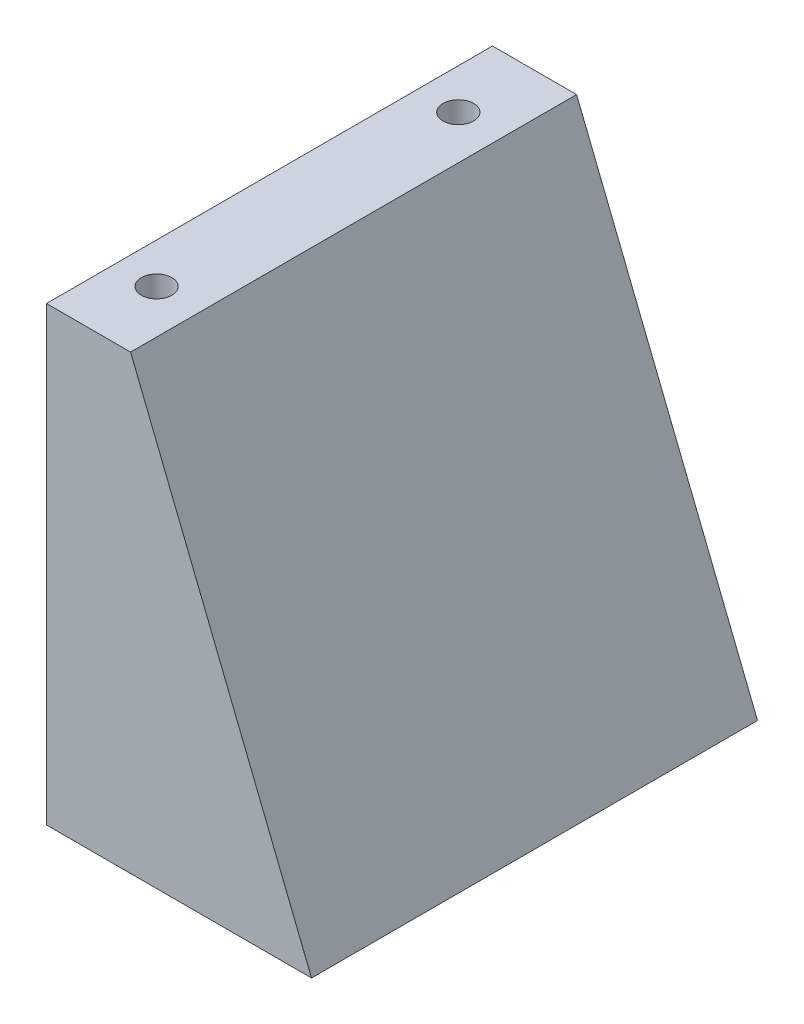
ISO-10303-21;
HEADER;
FILE_DESCRIPTION(('STEP AP214'),'2;1');
FILE_NAME('part.step','',(''),(''),'','','');
FILE_SCHEMA(('AUTOMOTIVE_DESIGN { 1 0 10303 214 1 1 1 1 }'));
ENDSEC;
DATA;
#1=APPLICATION_CONTEXT('core data for automotive mechanical design processes');
#2=APPLICATION_PROTOCOL_DEFINITION('international standard','automotive_design',2000,#1);
#3=PRODUCT_CONTEXT('',#1,'mechanical');
#4=PRODUCT('Part','Part','',(#3));
#5=PRODUCT_RELATED_PRODUCT_CATEGORY('part','',(#4));
#6=PRODUCT_DEFINITION_FORMATION('','',#4);
#7=PRODUCT_DEFINITION_CONTEXT('part definition',#1,'design');
#8=PRODUCT_DEFINITION('design','',#6,#7);
#9=PRODUCT_DEFINITION_SHAPE('','',#8);
#10=(LENGTH_UNIT() NAMED_UNIT(*) SI_UNIT(.MILLI.,.METRE.));
#11=(NAMED_UNIT(*) PLANE_ANGLE_UNIT() SI_UNIT($,.RADIAN.));
#12=(NAMED_UNIT(*) SI_UNIT($,.STERADIAN.) SOLID_ANGLE_UNIT());
#13=UNCERTAINTY_MEASURE_WITH_UNIT(LENGTH_MEASURE(1.E-05),#10,'distance_accuracy_value','');
#14=(GEOMETRIC_REPRESENTATION_CONTEXT(3) GLOBAL_UNCERTAINTY_ASSIGNED_CONTEXT((#13)) GLOBAL_UNIT_ASSIGNED_CONTEXT((#10,
#11,#12)) REPRESENTATION_CONTEXT('',''));
#15=CARTESIAN_POINT('',(0.,0.,0.));
#16=DIRECTION('',(0.,0.,1.));
#17=DIRECTION('',(1.,0.,0.));
#18=AXIS2_PLACEMENT_3D('',#15,#16,#17);
#19=CARTESIAN_POINT('',(0.,0.,43.75));
#20=DIRECTION('',(0.,1.,0.));
#21=DIRECTION('',(0.,0.,1.));
#22=AXIS2_PLACEMENT_3D('',#19,#20,#21);
#23=PLANE('',#22);
#24=DIRECTION('',(1.,0.,0.));
#25=VECTOR('',#24,1.);
#26=CARTESIAN_POINT('',(0.,0.,0.));
#27=LINE('',#26,#25);
#28=CARTESIAN_POINT('',(0.,0.,0.));
#29=VERTEX_POINT('',#28);
#30=CARTESIAN_POINT('',(26.,0.,0.));
#31=VERTEX_POINT('',#30);
#32=EDGE_CURVE('E106',#29,#31,#27,.T.);
#33=ORIENTED_EDGE('',*,*,#32,.T.);
#34=DIRECTION('',(0.,0.,-1.));
#35=VECTOR('',#34,1.);
#36=CARTESIAN_POINT('',(26.,0.,43.75));
#37=LINE('',#36,#35);
#38=CARTESIAN_POINT('',(26.,0.,43.75));
#39=VERTEX_POINT('',#38);
#40=EDGE_CURVE('E11',#39,#31,#37,.T.);
#41=ORIENTED_EDGE('',*,*,#40,.F.);
#42=DIRECTION('',(1.,0.,0.));
#43=VECTOR('',#42,1.);
#44=CARTESIAN_POINT('',(0.,0.,43.75));
#45=LINE('',#44,#43);
#46=CARTESIAN_POINT('',(0.,0.,43.75));
#47=VERTEX_POINT('',#46);
#48=EDGE_CURVE('E90',#47,#39,#45,.T.);
#49=ORIENTED_EDGE('',*,*,#48,.F.);
#50=DIRECTION('',(0.,0.,-1.));
#51=VECTOR('',#50,1.);
#52=CARTESIAN_POINT('',(0.,0.,43.75));
#53=LINE('',#52,#51);
#54=EDGE_CURVE('E102',#47,#29,#53,.T.);
#55=ORIENTED_EDGE('',*,*,#54,.T.);
#56=EDGE_LOOP('',(#33,#41,#49,#55));
#57=FACE_BOUND('',#56,.T.);
#58=ADVANCED_FACE('F38',(#57),#23,.F.);
#59=CARTESIAN_POINT('',(26.,0.,43.75));
#60=DIRECTION('',(-0.928259767790361,-0.37193252546905,0.));
#61=DIRECTION('',(0.37193252546905,-0.928259767790361,0.));
#62=AXIS2_PLACEMENT_3D('',#59,#60,#61);
#63=PLANE('',#62);
#64=DIRECTION('',(-0.37193252546905,0.928259767790361,0.));
#65=VECTOR('',#64,1.);
#66=CARTESIAN_POINT('',(26.,0.,0.));
#67=LINE('',#66,#65);
#68=CARTESIAN_POINT('',(8.25,44.3,0.));
#69=VERTEX_POINT('',#68);
#70=EDGE_CURVE('E95',#31,#69,#67,.T.);
#71=ORIENTED_EDGE('',*,*,#70,.T.);
#72=DIRECTION('',(0.,0.,-1.));
#73=VECTOR('',#72,1.);
#74=CARTESIAN_POINT('',(8.25,44.3,43.75));
#75=LINE('',#74,#73);
#76=CARTESIAN_POINT('',(8.25,44.3,43.75));
#77=VERTEX_POINT('',#76);
#78=EDGE_CURVE('E47',#77,#69,#75,.T.);
#79=ORIENTED_EDGE('',*,*,#78,.F.);
#80=DIRECTION('',(-0.37193252546905,0.928259767790361,0.));
#81=VECTOR('',#80,1.);
#82=CARTESIAN_POINT('',(26.,0.,43.75));
#83=LINE('',#82,#81);
#84=EDGE_CURVE('E85',#39,#77,#83,.T.);
#85=ORIENTED_EDGE('',*,*,#84,.F.);
#86=ORIENTED_EDGE('',*,*,#40,.T.);
#87=EDGE_LOOP('',(#71,#79,#85,#86));
#88=FACE_BOUND('',#87,.T.);
#89=ADVANCED_FACE('F94',(#88),#63,.F.);
#90=CARTESIAN_POINT('',(8.25,44.3,43.75));
#91=DIRECTION('',(0.,-1.,0.));
#92=DIRECTION('',(0.,0.,-1.));
#93=AXIS2_PLACEMENT_3D('',#90,#91,#92);
#94=PLANE('',#93);
#95=CARTESIAN_POINT('',(3.95,44.3,7.3));
#96=DIRECTION('',(0.,1.,0.));
#97=DIRECTION('',(0.,0.,1.));
#98=AXIS2_PLACEMENT_3D('',#95,#96,#97);
#99=CIRCLE('',#98,1.5);
#100=CARTESIAN_POINT('',(3.95,44.3,8.8));
#101=VERTEX_POINT('',#100);
#102=EDGE_CURVE('E167',#101,#101,#99,.T.);
#103=ORIENTED_EDGE('',*,*,#102,.F.);
#104=EDGE_LOOP('',(#103));
#105=FACE_BOUND('',#104,.T.);
#106=CARTESIAN_POINT('',(3.95,44.3,36.9));
#107=DIRECTION('',(0.,1.,0.));
#108=DIRECTION('',(0.,0.,1.));
#109=AXIS2_PLACEMENT_3D('',#106,#107,#108);
#110=CIRCLE('',#109,1.5);
#111=CARTESIAN_POINT('',(3.95,44.3,38.4));
#112=VERTEX_POINT('',#111);
#113=EDGE_CURVE('E159',#112,#112,#110,.T.);
#114=ORIENTED_EDGE('',*,*,#113,.F.);
#115=EDGE_LOOP('',(#114));
#116=FACE_BOUND('',#115,.T.);
#117=DIRECTION('',(-1.,0.,0.));
#118=VECTOR('',#117,1.);
#119=CARTESIAN_POINT('',(8.25,44.3,0.));
#120=LINE('',#119,#118);
#121=CARTESIAN_POINT('',(0.,44.3,0.));
#122=VERTEX_POINT('',#121);
#123=EDGE_CURVE('E72',#69,#122,#120,.T.);
#124=ORIENTED_EDGE('',*,*,#123,.T.);
#125=DIRECTION('',(0.,0.,-1.));
#126=VECTOR('',#125,1.);
#127=CARTESIAN_POINT('',(0.,44.3,43.75));
#128=LINE('',#127,#126);
#129=CARTESIAN_POINT('',(0.,44.3,43.75));
#130=VERTEX_POINT('',#129);
#131=EDGE_CURVE('E97',#130,#122,#128,.T.);
#132=ORIENTED_EDGE('',*,*,#131,.F.);
#133=DIRECTION('',(-1.,0.,0.));
#134=VECTOR('',#133,1.);
#135=CARTESIAN_POINT('',(8.25,44.3,43.75));
#136=LINE('',#135,#134);
#137=EDGE_CURVE('E88',#77,#130,#136,.T.);
#138=ORIENTED_EDGE('',*,*,#137,.F.);
#139=ORIENTED_EDGE('',*,*,#78,.T.);
#140=EDGE_LOOP('',(#124,#132,#138,#139));
#141=FACE_BOUND('',#140,.T.);
#142=ADVANCED_FACE('F98',(#105,#116,#141),#94,.F.);
#143=CARTESIAN_POINT('',(0.,0.,43.75));
#144=DIRECTION('',(1.,0.,0.));
#145=DIRECTION('',(0.,0.,-1.));
#146=AXIS2_PLACEMENT_3D('',#143,#144,#145);
#147=PLANE('',#146);
#148=CARTESIAN_POINT('',(0.,38.15,37.875));
#149=DIRECTION('',(-1.,0.,0.));
#150=DIRECTION('',(0.,0.,1.));
#151=AXIS2_PLACEMENT_3D('',#148,#149,#150);
#152=CIRCLE('',#151,1.6);
#153=CARTESIAN_POINT('',(0.,38.15,39.475));
#154=VERTEX_POINT('',#153);
#155=EDGE_CURVE('E144',#154,#154,#152,.T.);
#156=ORIENTED_EDGE('',*,*,#155,.F.);
#157=EDGE_LOOP('',(#156));
#158=FACE_BOUND('',#157,.T.);
#159=CARTESIAN_POINT('',(0.,6.15,5.875));
#160=DIRECTION('',(-1.,0.,0.));
#161=DIRECTION('',(0.,0.,1.));
#162=AXIS2_PLACEMENT_3D('',#159,#160,#161);
#163=CIRCLE('',#162,1.6);
#164=CARTESIAN_POINT('',(0.,6.15,7.475));
#165=VERTEX_POINT('',#164);
#166=EDGE_CURVE('E135',#165,#165,#163,.T.);
#167=ORIENTED_EDGE('',*,*,#166,.F.);
#168=EDGE_LOOP('',(#167));
#169=FACE_BOUND('',#168,.T.);
#170=CARTESIAN_POINT('',(0.,6.15,37.875));
#171=DIRECTION('',(-1.,0.,0.));
#172=DIRECTION('',(0.,0.,1.));
#173=AXIS2_PLACEMENT_3D('',#170,#171,#172);
#174=CIRCLE('',#173,1.6);
#175=CARTESIAN_POINT('',(0.,6.15,39.475));
#176=VERTEX_POINT('',#175);
#177=EDGE_CURVE('E151',#176,#176,#174,.T.);
#178=ORIENTED_EDGE('',*,*,#177,.F.);
#179=EDGE_LOOP('',(#178));
#180=FACE_BOUND('',#179,.T.);
#181=CARTESIAN_POINT('',(0.,38.15,5.875));
#182=DIRECTION('',(-1.,0.,0.));
#183=DIRECTION('',(0.,0.,1.));
#184=AXIS2_PLACEMENT_3D('',#181,#182,#183);
#185=CIRCLE('',#184,1.6);
#186=CARTESIAN_POINT('',(0.,38.15,7.475));
#187=VERTEX_POINT('',#186);
#188=EDGE_CURVE('E127',#187,#187,#185,.T.);
#189=ORIENTED_EDGE('',*,*,#188,.F.);
#190=EDGE_LOOP('',(#189));
#191=FACE_BOUND('',#190,.T.);
#192=DIRECTION('',(0.,-1.,0.));
#193=VECTOR('',#192,1.);
#194=CARTESIAN_POINT('',(0.,0.,0.));
#195=LINE('',#194,#193);
#196=EDGE_CURVE('E78',#122,#29,#195,.T.);
#197=ORIENTED_EDGE('',*,*,#196,.T.);
#198=ORIENTED_EDGE('',*,*,#54,.F.);
#199=DIRECTION('',(0.,-1.,0.));
#200=VECTOR('',#199,1.);
#201=CARTESIAN_POINT('',(0.,0.,43.75));
#202=LINE('',#201,#200);
#203=EDGE_CURVE('E55',#130,#47,#202,.T.);
#204=ORIENTED_EDGE('',*,*,#203,.F.);
#205=ORIENTED_EDGE('',*,*,#131,.T.);
#206=EDGE_LOOP('',(#197,#198,#204,#205));
#207=FACE_BOUND('',#206,.T.);
#208=ADVANCED_FACE('F120',(#158,#169,#180,#191,#207),#147,.F.);
#209=CARTESIAN_POINT('',(0.,0.,43.75));
#210=DIRECTION('',(0.,0.,1.));
#211=DIRECTION('',(1.,0.,0.));
#212=AXIS2_PLACEMENT_3D('',#209,#210,#211);
#213=PLANE('',#212);
#214=ORIENTED_EDGE('',*,*,#48,.T.);
#215=ORIENTED_EDGE('',*,*,#84,.T.);
#216=ORIENTED_EDGE('',*,*,#137,.T.);
#217=ORIENTED_EDGE('',*,*,#203,.T.);
#218=EDGE_LOOP('',(#214,#215,#216,#217));
#219=FACE_BOUND('',#218,.T.);
#220=ADVANCED_FACE('F86',(#219),#213,.T.);
#221=CARTESIAN_POINT('',(0.,0.,0.));
#222=DIRECTION('',(0.,0.,1.));
#223=DIRECTION('',(1.,0.,0.));
#224=AXIS2_PLACEMENT_3D('',#221,#222,#223);
#225=PLANE('',#224);
#226=ORIENTED_EDGE('',*,*,#32,.F.);
#227=ORIENTED_EDGE('',*,*,#196,.F.);
#228=ORIENTED_EDGE('',*,*,#123,.F.);
#229=ORIENTED_EDGE('',*,*,#70,.F.);
#230=EDGE_LOOP('',(#226,#227,#228,#229));
#231=FACE_BOUND('',#230,.T.);
#232=ADVANCED_FACE('F123',(#231),#225,.F.);
#233=CARTESIAN_POINT('',(3.,38.15,5.875));
#234=DIRECTION('',(-1.,0.,0.));
#235=DIRECTION('',(0.,0.,1.));
#236=AXIS2_PLACEMENT_3D('',#233,#234,#235);
#237=CYLINDRICAL_SURFACE('',#236,1.6);
#238=CARTESIAN_POINT('',(3.,38.15,5.875));
#239=DIRECTION('',(-1.,0.,0.));
#240=DIRECTION('',(0.,0.,1.));
#241=AXIS2_PLACEMENT_3D('',#238,#239,#240);
#242=CIRCLE('',#241,1.6);
#243=CARTESIAN_POINT('',(3.,38.15,7.475));
#244=VERTEX_POINT('',#243);
#245=EDGE_CURVE('E110',#244,#244,#242,.T.);
#246=ORIENTED_EDGE('',*,*,#245,.F.);
#247=EDGE_LOOP('',(#246));
#248=FACE_BOUND('',#247,.T.);
#249=ORIENTED_EDGE('',*,*,#188,.T.);
#250=EDGE_LOOP('',(#249));
#251=FACE_BOUND('',#250,.T.);
#252=ADVANCED_FACE('F218',(#248,#251),#237,.F.);
#253=CARTESIAN_POINT('',(3.,38.15,5.875));
#254=DIRECTION('',(-1.,0.,0.));
#255=DIRECTION('',(0.,0.,1.));
#256=AXIS2_PLACEMENT_3D('',#253,#254,#255);
#257=PLANE('',#256);
#258=ORIENTED_EDGE('',*,*,#245,.T.);
#259=EDGE_LOOP('',(#258));
#260=FACE_BOUND('',#259,.T.);
#261=ADVANCED_FACE('F223',(#260),#257,.T.);
#262=CARTESIAN_POINT('',(3.,6.15,37.875));
#263=DIRECTION('',(-1.,0.,0.));
#264=DIRECTION('',(0.,0.,1.));
#265=AXIS2_PLACEMENT_3D('',#262,#263,#264);
#266=CYLINDRICAL_SURFACE('',#265,1.6);
#267=CARTESIAN_POINT('',(3.,6.15,37.875));
#268=DIRECTION('',(-1.,0.,0.));
#269=DIRECTION('',(0.,0.,1.));
#270=AXIS2_PLACEMENT_3D('',#267,#268,#269);
#271=CIRCLE('',#270,1.6);
#272=CARTESIAN_POINT('',(3.,6.15,39.475));
#273=VERTEX_POINT('',#272);
#274=EDGE_CURVE('E140',#273,#273,#271,.T.);
#275=ORIENTED_EDGE('',*,*,#274,.F.);
#276=EDGE_LOOP('',(#275));
#277=FACE_BOUND('',#276,.T.);
#278=ORIENTED_EDGE('',*,*,#177,.T.);
#279=EDGE_LOOP('',(#278));
#280=FACE_BOUND('',#279,.T.);
#281=ADVANCED_FACE('F227',(#277,#280),#266,.F.);
#282=CARTESIAN_POINT('',(3.,6.15,37.875));
#283=DIRECTION('',(-1.,0.,0.));
#284=DIRECTION('',(0.,0.,1.));
#285=AXIS2_PLACEMENT_3D('',#282,#283,#284);
#286=PLANE('',#285);
#287=ORIENTED_EDGE('',*,*,#274,.T.);
#288=EDGE_LOOP('',(#287));
#289=FACE_BOUND('',#288,.T.);
#290=ADVANCED_FACE('F233',(#289),#286,.T.);
#291=CARTESIAN_POINT('',(3.,6.15,5.875));
#292=DIRECTION('',(-1.,0.,0.));
#293=DIRECTION('',(0.,0.,1.));
#294=AXIS2_PLACEMENT_3D('',#291,#292,#293);
#295=CYLINDRICAL_SURFACE('',#294,1.6);
#296=CARTESIAN_POINT('',(3.,6.15,5.875));
#297=DIRECTION('',(-1.,0.,0.));
#298=DIRECTION('',(0.,0.,1.));
#299=AXIS2_PLACEMENT_3D('',#296,#297,#298);
#300=CIRCLE('',#299,1.6);
#301=CARTESIAN_POINT('',(3.,6.15,7.475));
#302=VERTEX_POINT('',#301);
#303=EDGE_CURVE('E139',#302,#302,#300,.T.);
#304=ORIENTED_EDGE('',*,*,#303,.F.);
#305=EDGE_LOOP('',(#304));
#306=FACE_BOUND('',#305,.T.);
#307=ORIENTED_EDGE('',*,*,#166,.T.);
#308=EDGE_LOOP('',(#307));
#309=FACE_BOUND('',#308,.T.);
#310=ADVANCED_FACE('F229',(#306,#309),#295,.F.);
#311=CARTESIAN_POINT('',(3.,6.15,5.875));
#312=DIRECTION('',(-1.,0.,0.));
#313=DIRECTION('',(0.,0.,1.));
#314=AXIS2_PLACEMENT_3D('',#311,#312,#313);
#315=PLANE('',#314);
#316=ORIENTED_EDGE('',*,*,#303,.T.);
#317=EDGE_LOOP('',(#316));
#318=FACE_BOUND('',#317,.T.);
#319=ADVANCED_FACE('F232',(#318),#315,.T.);
#320=CARTESIAN_POINT('',(3.,38.15,37.875));
#321=DIRECTION('',(-1.,0.,0.));
#322=DIRECTION('',(0.,0.,1.));
#323=AXIS2_PLACEMENT_3D('',#320,#321,#322);
#324=CYLINDRICAL_SURFACE('',#323,1.6);
#325=CARTESIAN_POINT('',(3.,38.15,37.875));
#326=DIRECTION('',(-1.,0.,0.));
#327=DIRECTION('',(0.,0.,1.));
#328=AXIS2_PLACEMENT_3D('',#325,#326,#327);
#329=CIRCLE('',#328,1.6);
#330=CARTESIAN_POINT('',(3.,38.15,39.475));
#331=VERTEX_POINT('',#330);
#332=EDGE_CURVE('E131',#331,#331,#329,.T.);
#333=ORIENTED_EDGE('',*,*,#332,.F.);
#334=EDGE_LOOP('',(#333));
#335=FACE_BOUND('',#334,.T.);
#336=ORIENTED_EDGE('',*,*,#155,.T.);
#337=EDGE_LOOP('',(#336));
#338=FACE_BOUND('',#337,.T.);
#339=ADVANCED_FACE('F200',(#335,#338),#324,.F.);
#340=CARTESIAN_POINT('',(3.,38.15,37.875));
#341=DIRECTION('',(-1.,0.,0.));
#342=DIRECTION('',(0.,0.,1.));
#343=AXIS2_PLACEMENT_3D('',#340,#341,#342);
#344=PLANE('',#343);
#345=ORIENTED_EDGE('',*,*,#332,.T.);
#346=EDGE_LOOP('',(#345));
#347=FACE_BOUND('',#346,.T.);
#348=ADVANCED_FACE('F191',(#347),#344,.T.);
#349=CARTESIAN_POINT('',(3.95,41.3,36.9));
#350=DIRECTION('',(0.,1.,0.));
#351=DIRECTION('',(0.,0.,1.));
#352=AXIS2_PLACEMENT_3D('',#349,#350,#351);
#353=CYLINDRICAL_SURFACE('',#352,1.5);
#354=CARTESIAN_POINT('',(3.95,41.3,36.9));
#355=DIRECTION('',(0.,1.,0.));
#356=DIRECTION('',(0.,0.,1.));
#357=AXIS2_PLACEMENT_3D('',#354,#355,#356);
#358=CIRCLE('',#357,1.5);
#359=CARTESIAN_POINT('',(3.95,41.3,38.4));
#360=VERTEX_POINT('',#359);
#361=EDGE_CURVE('E163',#360,#360,#358,.T.);
#362=ORIENTED_EDGE('',*,*,#361,.F.);
#363=EDGE_LOOP('',(#362));
#364=FACE_BOUND('',#363,.T.);
#365=ORIENTED_EDGE('',*,*,#113,.T.);
#366=EDGE_LOOP('',(#365));
#367=FACE_BOUND('',#366,.T.);
#368=ADVANCED_FACE('F189',(#364,#367),#353,.F.);
#369=CARTESIAN_POINT('',(3.95,41.3,36.9));
#370=DIRECTION('',(0.,1.,0.));
#371=DIRECTION('',(0.,0.,1.));
#372=AXIS2_PLACEMENT_3D('',#369,#370,#371);
#373=PLANE('',#372);
#374=ORIENTED_EDGE('',*,*,#361,.T.);
#375=EDGE_LOOP('',(#374));
#376=FACE_BOUND('',#375,.T.);
#377=ADVANCED_FACE('F180',(#376),#373,.T.);
#378=CARTESIAN_POINT('',(3.95,41.3,7.3));
#379=DIRECTION('',(0.,1.,0.));
#380=DIRECTION('',(0.,0.,1.));
#381=AXIS2_PLACEMENT_3D('',#378,#379,#380);
#382=CYLINDRICAL_SURFACE('',#381,1.5);
#383=CARTESIAN_POINT('',(3.95,41.3,7.3));
#384=DIRECTION('',(0.,1.,0.));
#385=DIRECTION('',(0.,0.,1.));
#386=AXIS2_PLACEMENT_3D('',#383,#384,#385);
#387=CIRCLE('',#386,1.5);
#388=CARTESIAN_POINT('',(3.95,41.3,8.8));
#389=VERTEX_POINT('',#388);
#390=EDGE_CURVE('E155',#389,#389,#387,.T.);
#391=ORIENTED_EDGE('',*,*,#390,.F.);
#392=EDGE_LOOP('',(#391));
#393=FACE_BOUND('',#392,.T.);
#394=ORIENTED_EDGE('',*,*,#102,.T.);
#395=EDGE_LOOP('',(#394));
#396=FACE_BOUND('',#395,.T.);
#397=ADVANCED_FACE('F177',(#393,#396),#382,.F.);
#398=CARTESIAN_POINT('',(3.95,41.3,7.3));
#399=DIRECTION('',(0.,1.,0.));
#400=DIRECTION('',(0.,0.,1.));
#401=AXIS2_PLACEMENT_3D('',#398,#399,#400);
#402=PLANE('',#401);
#403=ORIENTED_EDGE('',*,*,#390,.T.);
#404=EDGE_LOOP('',(#403));
#405=FACE_BOUND('',#404,.T.);
#406=ADVANCED_FACE('F175',(#405),#402,.T.);
#407=CLOSED_SHELL('',(#58,#89,#142,#208,#220,#232,#252,#261,#281,#290,#310,#319,#339,#348,#368,
#377,#397,#406));
#408=MANIFOLD_SOLID_BREP('B2',#407);
#409=ADVANCED_BREP_SHAPE_REPRESENTATION('',(#18,#408),#14);
#410=SHAPE_DEFINITION_REPRESENTATION(#9,#409);
ENDSEC;
END-ISO-10303-21;
